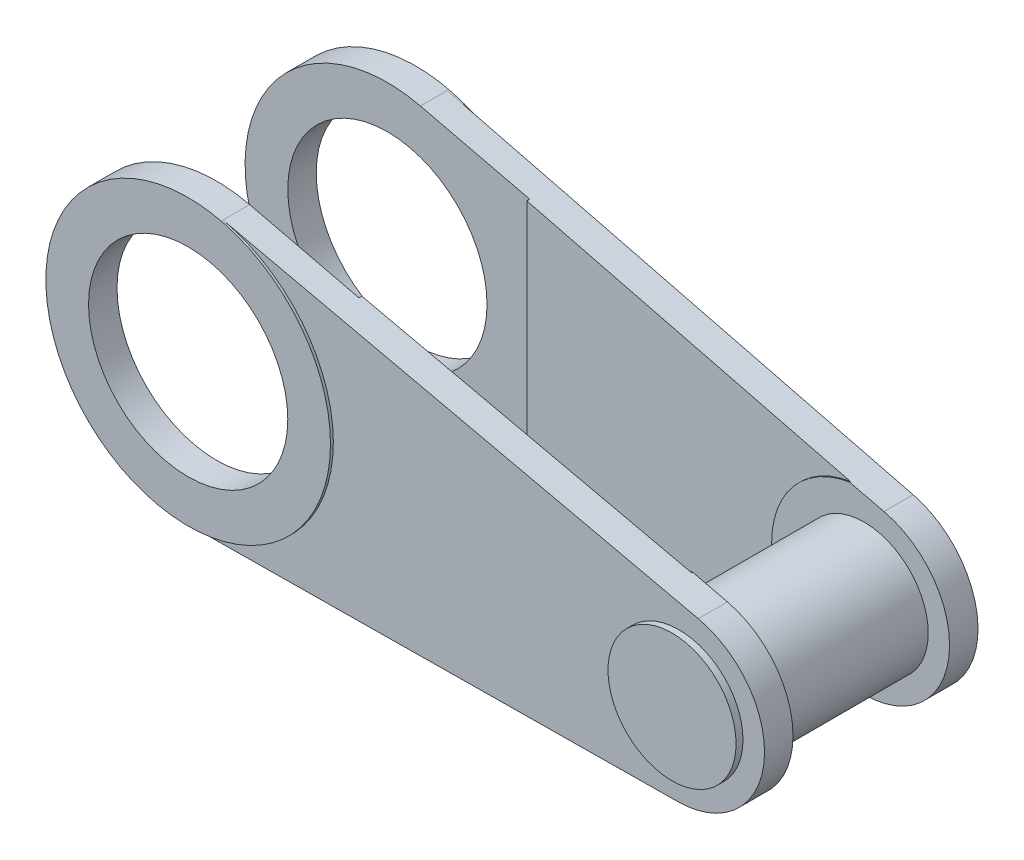
ISO-10303-21;
HEADER;
FILE_DESCRIPTION(('STEP AP214'),'2;1');
FILE_NAME('part.step','',(''),(''),'','','');
FILE_SCHEMA(('AUTOMOTIVE_DESIGN { 1 0 10303 214 1 1 1 1 }'));
ENDSEC;
DATA;
#1=APPLICATION_CONTEXT('core data for automotive mechanical design processes');
#2=APPLICATION_PROTOCOL_DEFINITION('international standard','automotive_design',2000,#1);
#3=PRODUCT_CONTEXT('',#1,'mechanical');
#4=PRODUCT('Part','Part','',(#3));
#5=PRODUCT_RELATED_PRODUCT_CATEGORY('part','',(#4));
#6=PRODUCT_DEFINITION_FORMATION('','',#4);
#7=PRODUCT_DEFINITION_CONTEXT('part definition',#1,'design');
#8=PRODUCT_DEFINITION('design','',#6,#7);
#9=PRODUCT_DEFINITION_SHAPE('','',#8);
#10=(LENGTH_UNIT() NAMED_UNIT(*) SI_UNIT(.MILLI.,.METRE.));
#11=(NAMED_UNIT(*) PLANE_ANGLE_UNIT() SI_UNIT($,.RADIAN.));
#12=(NAMED_UNIT(*) SI_UNIT($,.STERADIAN.) SOLID_ANGLE_UNIT());
#13=UNCERTAINTY_MEASURE_WITH_UNIT(LENGTH_MEASURE(1.E-05),#10,'distance_accuracy_value','');
#14=(GEOMETRIC_REPRESENTATION_CONTEXT(3) GLOBAL_UNCERTAINTY_ASSIGNED_CONTEXT((#13)) GLOBAL_UNIT_ASSIGNED_CONTEXT((#10,
#11,#12)) REPRESENTATION_CONTEXT('',''));
#15=CARTESIAN_POINT('',(0.,0.,0.));
#16=DIRECTION('',(0.,0.,1.));
#17=DIRECTION('',(1.,0.,0.));
#18=AXIS2_PLACEMENT_3D('',#15,#16,#17);
#19=CARTESIAN_POINT('',(0.,0.,0.));
#20=DIRECTION('',(0.,1.,0.));
#21=DIRECTION('',(0.,0.,1.));
#22=AXIS2_PLACEMENT_3D('',#19,#20,#21);
#23=PLANE('',#22);
#24=DIRECTION('',(0.,0.,-1.));
#25=VECTOR('',#24,1.);
#26=CARTESIAN_POINT('',(20.,0.,-6.));
#27=LINE('',#26,#25);
#28=CARTESIAN_POINT('',(20.,0.,-5.79990000249988));
#29=VERTEX_POINT('',#28);
#30=CARTESIAN_POINT('',(20.,0.,-6.));
#31=VERTEX_POINT('',#30);
#32=EDGE_CURVE('E284',#29,#31,#27,.T.);
#33=ORIENTED_EDGE('',*,*,#32,.T.);
#34=DIRECTION('',(-1.,0.,0.));
#35=VECTOR('',#34,1.);
#36=CARTESIAN_POINT('',(0.,0.,-6.));
#37=LINE('',#36,#35);
#38=CARTESIAN_POINT('',(10.,0.,-6.));
#39=VERTEX_POINT('',#38);
#40=EDGE_CURVE('E283',#31,#39,#37,.T.);
#41=ORIENTED_EDGE('',*,*,#40,.T.);
#42=DIRECTION('',(0.,0.,1.));
#43=VECTOR('',#42,1.);
#44=CARTESIAN_POINT('',(10.,0.,-25.));
#45=LINE('',#44,#43);
#46=CARTESIAN_POINT('',(10.,0.,-7.9));
#47=VERTEX_POINT('',#46);
#48=EDGE_CURVE('E409',#39,#47,#45,.F.);
#49=ORIENTED_EDGE('',*,*,#48,.T.);
#50=DIRECTION('',(-0.999950003749688,0.,-0.00999950003749657));
#51=VECTOR('',#50,1.);
#52=CARTESIAN_POINT('',(50.,0.,-7.50000000000002));
#53=LINE('',#52,#51);
#54=CARTESIAN_POINT('',(44.,0.,-7.56000000000001));
#55=VERTEX_POINT('',#54);
#56=EDGE_CURVE('E402',#55,#47,#53,.T.);
#57=ORIENTED_EDGE('',*,*,#56,.F.);
#58=DIRECTION('',(0.,0.,1.));
#59=VECTOR('',#58,1.);
#60=CARTESIAN_POINT('',(44.,0.,-25.));
#61=LINE('',#60,#59);
#62=CARTESIAN_POINT('',(44.,0.,-5.5));
#63=VERTEX_POINT('',#62);
#64=EDGE_CURVE('E406',#55,#63,#61,.T.);
#65=ORIENTED_EDGE('',*,*,#64,.T.);
#66=DIRECTION('',(-1.,0.,0.));
#67=VECTOR('',#66,1.);
#68=CARTESIAN_POINT('',(37.5,0.,-5.5));
#69=LINE('',#68,#67);
#70=CARTESIAN_POINT('',(41.5,0.,-5.5));
#71=VERTEX_POINT('',#70);
#72=EDGE_CURVE('E327',#63,#71,#69,.T.);
#73=ORIENTED_EDGE('',*,*,#72,.T.);
#74=DIRECTION('',(0.,0.,1.));
#75=VECTOR('',#74,1.);
#76=CARTESIAN_POINT('',(41.5,0.,-25.));
#77=LINE('',#76,#75);
#78=CARTESIAN_POINT('',(41.5,0.,-5.58490000249989));
#79=VERTEX_POINT('',#78);
#80=EDGE_CURVE('E380',#79,#71,#77,.T.);
#81=ORIENTED_EDGE('',*,*,#80,.F.);
#82=DIRECTION('',(-0.999950003749688,0.,-0.00999950003749657));
#83=VECTOR('',#82,1.);
#84=CARTESIAN_POINT('',(49.980000999925,0.,-5.50009999250064));
#85=LINE('',#84,#83);
#86=EDGE_CURVE('E368',#79,#29,#85,.T.);
#87=ORIENTED_EDGE('',*,*,#86,.T.);
#88=EDGE_LOOP('',(#33,#41,#49,#57,#65,#73,#81,#87));
#89=FACE_BOUND('',#88,.T.);
#90=ADVANCED_FACE('F155',(#89),#23,.F.);
#91=DIRECTION('',(1.,0.,0.));
#92=VECTOR('',#91,1.);
#93=CARTESIAN_POINT('',(0.,0.,6.));
#94=LINE('',#93,#92);
#95=CARTESIAN_POINT('',(10.,0.,6.));
#96=VERTEX_POINT('',#95);
#97=CARTESIAN_POINT('',(20.,0.,6.));
#98=VERTEX_POINT('',#97);
#99=EDGE_CURVE('E271',#96,#98,#94,.T.);
#100=ORIENTED_EDGE('',*,*,#99,.T.);
#101=CARTESIAN_POINT('',(20.,0.,5.79990000249987));
#102=VERTEX_POINT('',#101);
#103=EDGE_CURVE('E279',#98,#102,#27,.T.);
#104=ORIENTED_EDGE('',*,*,#103,.T.);
#105=DIRECTION('',(0.999950003749688,0.,-0.0099995000374972));
#106=VECTOR('',#105,1.);
#107=CARTESIAN_POINT('',(-0.0199990000749923,0.,6.00009999250063));
#108=LINE('',#107,#106);
#109=CARTESIAN_POINT('',(41.5,0.,5.58490000249986));
#110=VERTEX_POINT('',#109);
#111=EDGE_CURVE('E364',#102,#110,#108,.T.);
#112=ORIENTED_EDGE('',*,*,#111,.T.);
#113=CARTESIAN_POINT('',(41.5,0.,5.5));
#114=VERTEX_POINT('',#113);
#115=EDGE_CURVE('E379',#114,#110,#77,.T.);
#116=ORIENTED_EDGE('',*,*,#115,.F.);
#117=DIRECTION('',(1.,0.,0.));
#118=VECTOR('',#117,1.);
#119=CARTESIAN_POINT('',(37.5,0.,5.5));
#120=LINE('',#119,#118);
#121=CARTESIAN_POINT('',(44.,0.,5.5));
#122=VERTEX_POINT('',#121);
#123=EDGE_CURVE('E330',#114,#122,#120,.T.);
#124=ORIENTED_EDGE('',*,*,#123,.T.);
#125=CARTESIAN_POINT('',(44.,0.,7.55999999999999));
#126=VERTEX_POINT('',#125);
#127=EDGE_CURVE('E405',#122,#126,#61,.T.);
#128=ORIENTED_EDGE('',*,*,#127,.T.);
#129=DIRECTION('',(0.999950003749687,0.,-0.0099995000374972));
#130=VECTOR('',#129,1.);
#131=CARTESIAN_POINT('',(0.,0.,8.));
#132=LINE('',#131,#130);
#133=CARTESIAN_POINT('',(10.,0.,7.9));
#134=VERTEX_POINT('',#133);
#135=EDGE_CURVE('E399',#134,#126,#132,.T.);
#136=ORIENTED_EDGE('',*,*,#135,.F.);
#137=EDGE_CURVE('E289',#134,#96,#45,.F.);
#138=ORIENTED_EDGE('',*,*,#137,.T.);
#139=EDGE_LOOP('',(#100,#104,#112,#116,#124,#128,#136,#138));
#140=FACE_BOUND('',#139,.T.);
#141=ADVANCED_FACE('F286',(#140),#23,.F.);
#142=CARTESIAN_POINT('',(5.11689128586239,21.4457943598644,-25.));
#143=DIRECTION('',(-0.232081911262799,-0.972696245733788,0.));
#144=DIRECTION('',(0.972696245733788,-0.232081911262799,0.));
#145=AXIS2_PLACEMENT_3D('',#142,#143,#144);
#146=PLANE('',#145);
#147=DIRECTION('',(0.,0.,-1.));
#148=VECTOR('',#147,1.);
#149=CARTESIAN_POINT('',(20.,17.8947368421053,-25.));
#150=LINE('',#149,#148);
#151=CARTESIAN_POINT('',(20.,17.8947368421053,-5.79990000249988));
#152=VERTEX_POINT('',#151);
#153=CARTESIAN_POINT('',(20.,17.8947368421053,-6.));
#154=VERTEX_POINT('',#153);
#155=EDGE_CURVE('E307',#152,#154,#150,.T.);
#156=ORIENTED_EDGE('',*,*,#155,.F.);
#157=DIRECTION('',(0.97265023375542,-0.232070932966205,0.0097265023375539));
#158=VECTOR('',#157,1.);
#159=CARTESIAN_POINT('',(38.8612085593368,13.3945186595266,-5.61128791690652));
#160=LINE('',#159,#158);
#161=CARTESIAN_POINT('',(42.9607508532423,12.4163822525597,-5.57029249396747));
#162=VERTEX_POINT('',#161);
#163=EDGE_CURVE('E371',#152,#162,#160,.T.);
#164=ORIENTED_EDGE('',*,*,#163,.T.);
#165=DIRECTION('',(0.,0.,1.));
#166=VECTOR('',#165,1.);
#167=CARTESIAN_POINT('',(42.9607508532423,12.4163822525597,-25.));
#168=LINE('',#167,#166);
#169=CARTESIAN_POINT('',(42.9607508532423,12.4163822525597,-5.5));
#170=VERTEX_POINT('',#169);
#171=EDGE_CURVE('E376',#162,#170,#168,.T.);
#172=ORIENTED_EDGE('',*,*,#171,.T.);
#173=DIRECTION('',(-0.972696245733788,0.232081911262799,0.));
#174=VECTOR('',#173,1.);
#175=CARTESIAN_POINT('',(5.11689128586239,21.4457943598644,-5.5));
#176=LINE('',#175,#174);
#177=CARTESIAN_POINT('',(45.3924914675768,11.8361774744027,-5.5));
#178=VERTEX_POINT('',#177);
#179=EDGE_CURVE('E177',#178,#170,#176,.T.);
#180=ORIENTED_EDGE('',*,*,#179,.F.);
#181=DIRECTION('',(0.,0.,1.));
#182=VECTOR('',#181,1.);
#183=CARTESIAN_POINT('',(45.3924914675768,11.8361774744027,-25.));
#184=LINE('',#183,#182);
#185=CARTESIAN_POINT('',(45.3924914675768,11.8361774744027,-7.54607508532425));
#186=VERTEX_POINT('',#185);
#187=EDGE_CURVE('E384',#186,#178,#184,.T.);
#188=ORIENTED_EDGE('',*,*,#187,.F.);
#189=DIRECTION('',(0.97265023375542,-0.232070932966205,0.0097265023375539));
#190=VECTOR('',#189,1.);
#191=CARTESIAN_POINT('',(38.8801304749061,13.3900039568645,-7.61119869525095));
#192=LINE('',#191,#190);
#193=CARTESIAN_POINT('',(12.320819112628,19.7269624573379,-7.87679180887373));
#194=VERTEX_POINT('',#193);
#195=EDGE_CURVE('E411',#194,#186,#192,.T.);
#196=ORIENTED_EDGE('',*,*,#195,.F.);
#197=DIRECTION('',(0.,0.,1.));
#198=VECTOR('',#197,1.);
#199=CARTESIAN_POINT('',(12.320819112628,19.7269624573379,-25.));
#200=LINE('',#199,#198);
#201=CARTESIAN_POINT('',(12.320819112628,19.7269624573379,-6.));
#202=VERTEX_POINT('',#201);
#203=EDGE_CURVE('E389',#194,#202,#200,.T.);
#204=ORIENTED_EDGE('',*,*,#203,.T.);
#205=DIRECTION('',(-0.972696245733788,0.232081911262799,0.));
#206=VECTOR('',#205,1.);
#207=CARTESIAN_POINT('',(5.11689128586239,21.4457943598644,-6.));
#208=LINE('',#207,#206);
#209=EDGE_CURVE('E298',#154,#202,#208,.T.);
#210=ORIENTED_EDGE('',*,*,#209,.F.);
#211=EDGE_LOOP('',(#156,#164,#172,#180,#188,#196,#204,#210));
#212=FACE_BOUND('',#211,.T.);
#213=ADVANCED_FACE('F445',(#212),#146,.F.);
#214=DIRECTION('',(0.972696245733788,-0.232081911262799,0.));
#215=VECTOR('',#214,1.);
#216=CARTESIAN_POINT('',(5.11689128586239,21.4457943598644,6.));
#217=LINE('',#216,#215);
#218=CARTESIAN_POINT('',(12.320819112628,19.7269624573379,6.));
#219=VERTEX_POINT('',#218);
#220=CARTESIAN_POINT('',(20.,17.8947368421053,6.));
#221=VERTEX_POINT('',#220);
#222=EDGE_CURVE('E274',#219,#221,#217,.T.);
#223=ORIENTED_EDGE('',*,*,#222,.F.);
#224=CARTESIAN_POINT('',(12.320819112628,19.7269624573379,7.87679180887372));
#225=VERTEX_POINT('',#224);
#226=EDGE_CURVE('E383',#219,#225,#200,.T.);
#227=ORIENTED_EDGE('',*,*,#226,.T.);
#228=DIRECTION('',(-0.97265023375542,0.232070932966205,0.00972650233755451));
#229=VECTOR('',#228,1.);
#230=CARTESIAN_POINT('',(-8.42702362870361,24.6773249359714,8.08427023628704));
#231=LINE('',#230,#229);
#232=CARTESIAN_POINT('',(45.3924914675768,11.8361774744027,7.54607508532421));
#233=VERTEX_POINT('',#232);
#234=EDGE_CURVE('E387',#233,#225,#231,.T.);
#235=ORIENTED_EDGE('',*,*,#234,.F.);
#236=CARTESIAN_POINT('',(45.3924914675768,11.8361774744027,5.5));
#237=VERTEX_POINT('',#236);
#238=EDGE_CURVE('E388',#237,#233,#184,.T.);
#239=ORIENTED_EDGE('',*,*,#238,.F.);
#240=DIRECTION('',(0.972696245733788,-0.232081911262799,0.));
#241=VECTOR('',#240,1.);
#242=CARTESIAN_POINT('',(5.11689128586239,21.4457943598644,5.5));
#243=LINE('',#242,#241);
#244=CARTESIAN_POINT('',(42.9607508532423,12.4163822525597,5.5));
#245=VERTEX_POINT('',#244);
#246=EDGE_CURVE('E333',#245,#237,#243,.T.);
#247=ORIENTED_EDGE('',*,*,#246,.F.);
#248=CARTESIAN_POINT('',(42.9607508532424,12.4163822525597,5.57029249396744));
#249=VERTEX_POINT('',#248);
#250=EDGE_CURVE('E373',#245,#249,#168,.T.);
#251=ORIENTED_EDGE('',*,*,#250,.T.);
#252=DIRECTION('',(-0.97265023375542,0.232070932966205,0.00972650233755451));
#253=VECTOR('',#252,1.);
#254=CARTESIAN_POINT('',(-8.44594554427292,24.6818396386335,6.08435945794261));
#255=LINE('',#254,#253);
#256=CARTESIAN_POINT('',(20.,17.8947368421053,5.79990000249987));
#257=VERTEX_POINT('',#256);
#258=EDGE_CURVE('E360',#249,#257,#255,.T.);
#259=ORIENTED_EDGE('',*,*,#258,.T.);
#260=DIRECTION('',(0.,0.,-1.));
#261=VECTOR('',#260,1.);
#262=CARTESIAN_POINT('',(20.,17.8947368421053,-25.));
#263=LINE('',#262,#261);
#264=EDGE_CURVE('E170',#221,#257,#263,.T.);
#265=ORIENTED_EDGE('',*,*,#264,.F.);
#266=EDGE_LOOP('',(#223,#227,#235,#239,#247,#251,#259,#265));
#267=FACE_BOUND('',#266,.T.);
#268=ADVANCED_FACE('F582',(#267),#146,.F.);
#269=CARTESIAN_POINT('',(49.980000999925,60.,-5.50009999250064));
#270=DIRECTION('',(-0.00999950003749657,0.,0.999950003749687));
#271=DIRECTION('',(0.999950003749688,0.,0.00999950003749657));
#272=AXIS2_PLACEMENT_3D('',#269,#270,#271);
#273=PLANE('',#272);
#274=ORIENTED_EDGE('',*,*,#163,.F.);
#275=DIRECTION('',(0.,-1.,0.));
#276=VECTOR('',#275,1.);
#277=CARTESIAN_POINT('',(20.,60.,-5.79990000249988));
#278=LINE('',#277,#276);
#279=EDGE_CURVE('E305',#152,#29,#278,.T.);
#280=ORIENTED_EDGE('',*,*,#279,.T.);
#281=ORIENTED_EDGE('',*,*,#86,.F.);
#282=CARTESIAN_POINT('',(44.,6.,-5.55990000249989));
#283=DIRECTION('',(-0.00999950003749657,0.,0.999950003749687));
#284=DIRECTION('',(0.999950003749688,0.,0.00999950003749657));
#285=AXIS2_PLACEMENT_3D('',#282,#283,#284);
#286=ELLIPSE('',#285,6.5003249918754,6.5);
#287=EDGE_CURVE('E365',#162,#79,#286,.T.);
#288=ORIENTED_EDGE('',*,*,#287,.F.);
#289=EDGE_LOOP('',(#274,#280,#281,#288));
#290=FACE_BOUND('',#289,.T.);
#291=ADVANCED_FACE('F485',(#290),#273,.T.);
#292=CARTESIAN_POINT('',(10.,10.,-25.));
#293=DIRECTION('',(0.,0.,1.));
#294=DIRECTION('',(1.,0.,0.));
#295=AXIS2_PLACEMENT_3D('',#292,#293,#294);
#296=CYLINDRICAL_SURFACE('',#295,10.);
#297=CARTESIAN_POINT('',(10.,10.,8.));
#298=DIRECTION('',(0.,0.,1.));
#299=DIRECTION('',(1.,0.,0.));
#300=AXIS2_PLACEMENT_3D('',#297,#298,#299);
#301=CIRCLE('',#300,10.);
#302=CARTESIAN_POINT('',(20.,10.,8.));
#303=VERTEX_POINT('',#302);
#304=EDGE_CURVE('E349',#303,#303,#301,.T.);
#305=ORIENTED_EDGE('',*,*,#304,.F.);
#306=EDGE_LOOP('',(#305));
#307=FACE_BOUND('',#306,.T.);
#308=CARTESIAN_POINT('',(10.,10.,6.));
#309=DIRECTION('',(0.,0.,-1.));
#310=DIRECTION('',(-1.,0.,0.));
#311=AXIS2_PLACEMENT_3D('',#308,#309,#310);
#312=CIRCLE('',#311,10.);
#313=EDGE_CURVE('E301',#96,#219,#312,.T.);
#314=ORIENTED_EDGE('',*,*,#313,.F.);
#315=ORIENTED_EDGE('',*,*,#137,.F.);
#316=CARTESIAN_POINT('',(10.,10.,7.9));
#317=DIRECTION('',(-0.0099995000374972,0.,-0.999950003749688));
#318=DIRECTION('',(0.999950003749688,0.,-0.0099995000374972));
#319=AXIS2_PLACEMENT_3D('',#316,#317,#318);
#320=ELLIPSE('',#319,10.0004999875006,10.);
#321=EDGE_CURVE('E357',#134,#225,#320,.F.);
#322=ORIENTED_EDGE('',*,*,#321,.T.);
#323=ORIENTED_EDGE('',*,*,#226,.F.);
#324=EDGE_LOOP('',(#314,#315,#322,#323));
#325=FACE_BOUND('',#324,.T.);
#326=ADVANCED_FACE('F597',(#307,#325),#296,.T.);
#327=CARTESIAN_POINT('',(10.,10.,-8.));
#328=DIRECTION('',(0.,0.,1.));
#329=DIRECTION('',(1.,0.,0.));
#330=AXIS2_PLACEMENT_3D('',#327,#328,#329);
#331=CIRCLE('',#330,10.);
#332=CARTESIAN_POINT('',(20.,10.,-8.));
#333=VERTEX_POINT('',#332);
#334=EDGE_CURVE('E346',#333,#333,#331,.T.);
#335=ORIENTED_EDGE('',*,*,#334,.T.);
#336=EDGE_LOOP('',(#335));
#337=FACE_BOUND('',#336,.T.);
#338=CARTESIAN_POINT('',(10.,10.,-6.));
#339=DIRECTION('',(0.,0.,1.));
#340=DIRECTION('',(1.,0.,0.));
#341=AXIS2_PLACEMENT_3D('',#338,#339,#340);
#342=CIRCLE('',#341,10.);
#343=EDGE_CURVE('E296',#202,#39,#342,.T.);
#344=ORIENTED_EDGE('',*,*,#343,.F.);
#345=ORIENTED_EDGE('',*,*,#203,.F.);
#346=CARTESIAN_POINT('',(10.,10.,-7.9));
#347=DIRECTION('',(-0.00999950003749657,0.,0.999950003749687));
#348=DIRECTION('',(-0.999950003749688,0.,-0.00999950003749657));
#349=AXIS2_PLACEMENT_3D('',#346,#347,#348);
#350=ELLIPSE('',#349,10.0004999875006,10.);
#351=EDGE_CURVE('E352',#194,#47,#350,.F.);
#352=ORIENTED_EDGE('',*,*,#351,.T.);
#353=ORIENTED_EDGE('',*,*,#48,.F.);
#354=EDGE_LOOP('',(#344,#345,#352,#353));
#355=FACE_BOUND('',#354,.T.);
#356=ADVANCED_FACE('F434',(#337,#355),#296,.T.);
#357=CARTESIAN_POINT('',(-0.0199990000749923,60.,6.00009999250063));
#358=DIRECTION('',(-0.0099995000374972,0.,-0.999950003749688));
#359=DIRECTION('',(-0.999950003749688,0.,0.0099995000374972));
#360=AXIS2_PLACEMENT_3D('',#357,#358,#359);
#361=PLANE('',#360);
#362=ORIENTED_EDGE('',*,*,#111,.F.);
#363=DIRECTION('',(0.,1.,0.));
#364=VECTOR('',#363,1.);
#365=CARTESIAN_POINT('',(20.,60.,5.79990000249987));
#366=LINE('',#365,#364);
#367=EDGE_CURVE('E12',#102,#257,#366,.T.);
#368=ORIENTED_EDGE('',*,*,#367,.T.);
#369=ORIENTED_EDGE('',*,*,#258,.F.);
#370=CARTESIAN_POINT('',(44.,6.,5.55990000249986));
#371=DIRECTION('',(-0.0099995000374972,0.,-0.999950003749688));
#372=DIRECTION('',(-0.999950003749688,0.,0.0099995000374972));
#373=AXIS2_PLACEMENT_3D('',#370,#371,#372);
#374=ELLIPSE('',#373,6.5003249918754,6.5);
#375=EDGE_CURVE('E361',#110,#249,#374,.T.);
#376=ORIENTED_EDGE('',*,*,#375,.F.);
#377=EDGE_LOOP('',(#362,#368,#369,#376));
#378=FACE_BOUND('',#377,.T.);
#379=ADVANCED_FACE('F425',(#378),#361,.T.);
#380=CARTESIAN_POINT('',(10.,10.,-25.));
#381=DIRECTION('',(0.,0.,1.));
#382=DIRECTION('',(1.,0.,0.));
#383=AXIS2_PLACEMENT_3D('',#380,#381,#382);
#384=CYLINDRICAL_SURFACE('',#383,7.);
#385=CARTESIAN_POINT('',(10.,10.,8.));
#386=DIRECTION('',(0.,0.,1.));
#387=DIRECTION('',(1.,0.,0.));
#388=AXIS2_PLACEMENT_3D('',#385,#386,#387);
#389=CIRCLE('',#388,7.);
#390=CARTESIAN_POINT('',(17.,10.,8.));
#391=VERTEX_POINT('',#390);
#392=EDGE_CURVE('E343',#391,#391,#389,.T.);
#393=ORIENTED_EDGE('',*,*,#392,.T.);
#394=EDGE_LOOP('',(#393));
#395=FACE_BOUND('',#394,.T.);
#396=CARTESIAN_POINT('',(10.,10.,6.));
#397=DIRECTION('',(0.,0.,-1.));
#398=DIRECTION('',(-1.,0.,0.));
#399=AXIS2_PLACEMENT_3D('',#396,#397,#398);
#400=CIRCLE('',#399,7.);
#401=CARTESIAN_POINT('',(3.,10.,6.));
#402=VERTEX_POINT('',#401);
#403=EDGE_CURVE('E300',#402,#402,#400,.F.);
#404=ORIENTED_EDGE('',*,*,#403,.F.);
#405=EDGE_LOOP('',(#404));
#406=FACE_BOUND('',#405,.T.);
#407=ADVANCED_FACE('F422',(#395,#406),#384,.F.);
#408=CARTESIAN_POINT('',(10.,10.,-8.));
#409=DIRECTION('',(0.,0.,1.));
#410=DIRECTION('',(1.,0.,0.));
#411=AXIS2_PLACEMENT_3D('',#408,#409,#410);
#412=CIRCLE('',#411,7.);
#413=CARTESIAN_POINT('',(17.,10.,-8.));
#414=VERTEX_POINT('',#413);
#415=EDGE_CURVE('E342',#414,#414,#412,.T.);
#416=ORIENTED_EDGE('',*,*,#415,.F.);
#417=EDGE_LOOP('',(#416));
#418=FACE_BOUND('',#417,.T.);
#419=CARTESIAN_POINT('',(10.,10.,-6.));
#420=DIRECTION('',(0.,0.,1.));
#421=DIRECTION('',(1.,0.,0.));
#422=AXIS2_PLACEMENT_3D('',#419,#420,#421);
#423=CIRCLE('',#422,7.);
#424=CARTESIAN_POINT('',(17.,10.,-6.));
#425=VERTEX_POINT('',#424);
#426=EDGE_CURVE('E275',#425,#425,#423,.F.);
#427=ORIENTED_EDGE('',*,*,#426,.F.);
#428=EDGE_LOOP('',(#427));
#429=FACE_BOUND('',#428,.T.);
#430=ADVANCED_FACE('F424',(#418,#429),#384,.F.);
#431=CARTESIAN_POINT('',(44.,6.,-25.));
#432=DIRECTION('',(0.,0.,1.));
#433=DIRECTION('',(1.,0.,0.));
#434=AXIS2_PLACEMENT_3D('',#431,#432,#433);
#435=CYLINDRICAL_SURFACE('',#434,6.);
#436=ORIENTED_EDGE('',*,*,#187,.T.);
#437=CARTESIAN_POINT('',(44.,6.,-5.5));
#438=DIRECTION('',(0.,0.,1.));
#439=DIRECTION('',(1.,0.,0.));
#440=AXIS2_PLACEMENT_3D('',#437,#438,#439);
#441=CIRCLE('',#440,6.);
#442=EDGE_CURVE('E339',#178,#63,#441,.F.);
#443=ORIENTED_EDGE('',*,*,#442,.T.);
#444=ORIENTED_EDGE('',*,*,#64,.F.);
#445=CARTESIAN_POINT('',(44.,6.,-7.56000000000001));
#446=DIRECTION('',(-0.00999950003749657,0.,0.999950003749687));
#447=DIRECTION('',(0.999950003749688,0.,0.00999950003749657));
#448=AXIS2_PLACEMENT_3D('',#445,#446,#447);
#449=ELLIPSE('',#448,6.00029999250037,6.);
#450=EDGE_CURVE('E394',#55,#186,#449,.T.);
#451=ORIENTED_EDGE('',*,*,#450,.T.);
#452=EDGE_LOOP('',(#436,#443,#444,#451));
#453=FACE_BOUND('',#452,.T.);
#454=ADVANCED_FACE('F432',(#453),#435,.T.);
#455=ORIENTED_EDGE('',*,*,#127,.F.);
#456=CARTESIAN_POINT('',(44.,6.,5.5));
#457=DIRECTION('',(0.,0.,-1.));
#458=DIRECTION('',(-1.,0.,0.));
#459=AXIS2_PLACEMENT_3D('',#456,#457,#458);
#460=CIRCLE('',#459,6.);
#461=EDGE_CURVE('E335',#122,#237,#460,.F.);
#462=ORIENTED_EDGE('',*,*,#461,.T.);
#463=ORIENTED_EDGE('',*,*,#238,.T.);
#464=CARTESIAN_POINT('',(44.,6.,7.55999999999998));
#465=DIRECTION('',(-0.0099995000374972,0.,-0.999950003749688));
#466=DIRECTION('',(-0.999950003749688,0.,0.0099995000374972));
#467=AXIS2_PLACEMENT_3D('',#464,#465,#466);
#468=ELLIPSE('',#467,6.00029999250037,6.);
#469=EDGE_CURVE('E396',#233,#126,#468,.T.);
#470=ORIENTED_EDGE('',*,*,#469,.T.);
#471=EDGE_LOOP('',(#455,#462,#463,#470));
#472=FACE_BOUND('',#471,.T.);
#473=ADVANCED_FACE('F642',(#472),#435,.T.);
#474=CARTESIAN_POINT('',(44.,6.,-25.));
#475=DIRECTION('',(0.,0.,1.));
#476=DIRECTION('',(1.,0.,0.));
#477=AXIS2_PLACEMENT_3D('',#474,#475,#476);
#478=CYLINDRICAL_SURFACE('',#477,6.5);
#479=ORIENTED_EDGE('',*,*,#80,.T.);
#480=CARTESIAN_POINT('',(44.,6.,-5.5));
#481=DIRECTION('',(0.,0.,1.));
#482=DIRECTION('',(1.,0.,0.));
#483=AXIS2_PLACEMENT_3D('',#480,#481,#482);
#484=CIRCLE('',#483,6.5);
#485=EDGE_CURVE('E163',#71,#170,#484,.F.);
#486=ORIENTED_EDGE('',*,*,#485,.T.);
#487=ORIENTED_EDGE('',*,*,#171,.F.);
#488=ORIENTED_EDGE('',*,*,#287,.T.);
#489=EDGE_LOOP('',(#479,#486,#487,#488));
#490=FACE_BOUND('',#489,.T.);
#491=ADVANCED_FACE('F487',(#490),#478,.T.);
#492=CARTESIAN_POINT('',(44.,6.,5.5));
#493=DIRECTION('',(0.,0.,-1.));
#494=DIRECTION('',(-1.,0.,0.));
#495=AXIS2_PLACEMENT_3D('',#492,#493,#494);
#496=CIRCLE('',#495,6.5);
#497=EDGE_CURVE('E414',#245,#114,#496,.F.);
#498=ORIENTED_EDGE('',*,*,#497,.T.);
#499=ORIENTED_EDGE('',*,*,#115,.T.);
#500=ORIENTED_EDGE('',*,*,#375,.T.);
#501=ORIENTED_EDGE('',*,*,#250,.F.);
#502=EDGE_LOOP('',(#498,#499,#500,#501));
#503=FACE_BOUND('',#502,.T.);
#504=ADVANCED_FACE('F457',(#503),#478,.T.);
#505=CARTESIAN_POINT('',(0.,60.,8.));
#506=DIRECTION('',(-0.0099995000374972,0.,-0.999950003749688));
#507=DIRECTION('',(-0.999950003749688,0.,0.0099995000374972));
#508=AXIS2_PLACEMENT_3D('',#505,#506,#507);
#509=PLANE('',#508);
#510=CARTESIAN_POINT('',(44.,6.,7.55999999999999));
#511=DIRECTION('',(-0.0099995000374972,0.,-0.999950003749688));
#512=DIRECTION('',(0.999950003749688,0.,-0.0099995000374972));
#513=AXIS2_PLACEMENT_3D('',#510,#511,#512);
#514=ELLIPSE('',#513,4.50022499437528,4.5);
#515=CARTESIAN_POINT('',(48.5,6.,7.51499999999998));
#516=VERTEX_POINT('',#515);
#517=EDGE_CURVE('E324',#516,#516,#514,.F.);
#518=ORIENTED_EDGE('',*,*,#517,.F.);
#519=EDGE_LOOP('',(#518));
#520=FACE_BOUND('',#519,.T.);
#521=ORIENTED_EDGE('',*,*,#321,.F.);
#522=ORIENTED_EDGE('',*,*,#135,.T.);
#523=ORIENTED_EDGE('',*,*,#469,.F.);
#524=ORIENTED_EDGE('',*,*,#234,.T.);
#525=EDGE_LOOP('',(#521,#522,#523,#524));
#526=FACE_BOUND('',#525,.T.);
#527=ADVANCED_FACE('F157',(#520,#526),#509,.F.);
#528=CARTESIAN_POINT('',(50.,60.,-7.50000000000002));
#529=DIRECTION('',(-0.00999950003749657,0.,0.999950003749687));
#530=DIRECTION('',(0.999950003749688,0.,0.00999950003749657));
#531=AXIS2_PLACEMENT_3D('',#528,#529,#530);
#532=PLANE('',#531);
#533=CARTESIAN_POINT('',(44.,6.,-7.56000000000001));
#534=DIRECTION('',(-0.00999950003749657,0.,0.999950003749687));
#535=DIRECTION('',(-0.999950003749688,0.,-0.00999950003749657));
#536=AXIS2_PLACEMENT_3D('',#533,#534,#535);
#537=ELLIPSE('',#536,4.50022499437528,4.5);
#538=CARTESIAN_POINT('',(39.5,6.,-7.60500000000001));
#539=VERTEX_POINT('',#538);
#540=EDGE_CURVE('E321',#539,#539,#537,.F.);
#541=ORIENTED_EDGE('',*,*,#540,.F.);
#542=EDGE_LOOP('',(#541));
#543=FACE_BOUND('',#542,.T.);
#544=ORIENTED_EDGE('',*,*,#351,.F.);
#545=ORIENTED_EDGE('',*,*,#195,.T.);
#546=ORIENTED_EDGE('',*,*,#450,.F.);
#547=ORIENTED_EDGE('',*,*,#56,.T.);
#548=EDGE_LOOP('',(#544,#545,#546,#547));
#549=FACE_BOUND('',#548,.T.);
#550=ADVANCED_FACE('F446',(#543,#549),#532,.F.);
#551=CARTESIAN_POINT('',(10.,10.,-8.));
#552=DIRECTION('',(0.,0.,1.));
#553=DIRECTION('',(1.,0.,0.));
#554=AXIS2_PLACEMENT_3D('',#551,#552,#553);
#555=PLANE('',#554);
#556=ORIENTED_EDGE('',*,*,#334,.F.);
#557=EDGE_LOOP('',(#556));
#558=FACE_BOUND('',#557,.T.);
#559=ORIENTED_EDGE('',*,*,#415,.T.);
#560=EDGE_LOOP('',(#559));
#561=FACE_BOUND('',#560,.T.);
#562=ADVANCED_FACE('F448',(#558,#561),#555,.F.);
#563=CARTESIAN_POINT('',(10.,10.,8.));
#564=DIRECTION('',(0.,0.,1.));
#565=DIRECTION('',(1.,0.,0.));
#566=AXIS2_PLACEMENT_3D('',#563,#564,#565);
#567=PLANE('',#566);
#568=ORIENTED_EDGE('',*,*,#304,.T.);
#569=EDGE_LOOP('',(#568));
#570=FACE_BOUND('',#569,.T.);
#571=ORIENTED_EDGE('',*,*,#392,.F.);
#572=EDGE_LOOP('',(#571));
#573=FACE_BOUND('',#572,.T.);
#574=ADVANCED_FACE('F454',(#570,#573),#567,.T.);
#575=CARTESIAN_POINT('',(37.5,20.,5.5));
#576=DIRECTION('',(0.,0.,-1.));
#577=DIRECTION('',(-1.,0.,0.));
#578=AXIS2_PLACEMENT_3D('',#575,#576,#577);
#579=PLANE('',#578);
#580=ORIENTED_EDGE('',*,*,#123,.F.);
#581=ORIENTED_EDGE('',*,*,#497,.F.);
#582=ORIENTED_EDGE('',*,*,#246,.T.);
#583=ORIENTED_EDGE('',*,*,#461,.F.);
#584=EDGE_LOOP('',(#580,#581,#582,#583));
#585=FACE_BOUND('',#584,.T.);
#586=CARTESIAN_POINT('',(44.,6.,5.5));
#587=DIRECTION('',(0.,0.,-1.));
#588=DIRECTION('',(-1.,0.,0.));
#589=AXIS2_PLACEMENT_3D('',#586,#587,#588);
#590=CIRCLE('',#589,4.5);
#591=CARTESIAN_POINT('',(39.5,6.,5.5));
#592=VERTEX_POINT('',#591);
#593=EDGE_CURVE('E318',#592,#592,#590,.F.);
#594=ORIENTED_EDGE('',*,*,#593,.T.);
#595=EDGE_LOOP('',(#594));
#596=FACE_BOUND('',#595,.T.);
#597=ADVANCED_FACE('F493',(#585,#596),#579,.T.);
#598=CARTESIAN_POINT('',(37.5,20.,-5.5));
#599=DIRECTION('',(0.,0.,1.));
#600=DIRECTION('',(1.,0.,0.));
#601=AXIS2_PLACEMENT_3D('',#598,#599,#600);
#602=PLANE('',#601);
#603=ORIENTED_EDGE('',*,*,#179,.T.);
#604=ORIENTED_EDGE('',*,*,#485,.F.);
#605=ORIENTED_EDGE('',*,*,#72,.F.);
#606=ORIENTED_EDGE('',*,*,#442,.F.);
#607=EDGE_LOOP('',(#603,#604,#605,#606));
#608=FACE_BOUND('',#607,.T.);
#609=CARTESIAN_POINT('',(44.,6.,-5.5));
#610=DIRECTION('',(0.,0.,1.));
#611=DIRECTION('',(1.,0.,0.));
#612=AXIS2_PLACEMENT_3D('',#609,#610,#611);
#613=CIRCLE('',#612,4.5);
#614=CARTESIAN_POINT('',(48.5,6.,-5.5));
#615=VERTEX_POINT('',#614);
#616=EDGE_CURVE('E313',#615,#615,#613,.F.);
#617=ORIENTED_EDGE('',*,*,#616,.T.);
#618=EDGE_LOOP('',(#617));
#619=FACE_BOUND('',#618,.T.);
#620=ADVANCED_FACE('F489',(#608,#619),#602,.T.);
#621=CARTESIAN_POINT('',(44.,6.,8.));
#622=DIRECTION('',(0.,0.,-1.));
#623=DIRECTION('',(-1.,0.,0.));
#624=AXIS2_PLACEMENT_3D('',#621,#622,#623);
#625=CYLINDRICAL_SURFACE('',#624,4.5);
#626=ORIENTED_EDGE('',*,*,#593,.F.);
#627=EDGE_LOOP('',(#626));
#628=FACE_BOUND('',#627,.T.);
#629=ORIENTED_EDGE('',*,*,#616,.F.);
#630=EDGE_LOOP('',(#629));
#631=FACE_BOUND('',#630,.T.);
#632=ADVANCED_FACE('F492',(#628,#631),#625,.T.);
#633=CARTESIAN_POINT('',(44.,6.,-8.));
#634=DIRECTION('',(0.,0.,1.));
#635=DIRECTION('',(1.,0.,0.));
#636=AXIS2_PLACEMENT_3D('',#633,#634,#635);
#637=PLANE('',#636);
#638=CARTESIAN_POINT('',(44.,6.,-8.));
#639=DIRECTION('',(0.,0.,1.));
#640=DIRECTION('',(1.,0.,0.));
#641=AXIS2_PLACEMENT_3D('',#638,#639,#640);
#642=CIRCLE('',#641,4.5);
#643=CARTESIAN_POINT('',(48.5,6.,-8.));
#644=VERTEX_POINT('',#643);
#645=EDGE_CURVE('E309',#644,#644,#642,.T.);
#646=ORIENTED_EDGE('',*,*,#645,.F.);
#647=EDGE_LOOP('',(#646));
#648=FACE_BOUND('',#647,.T.);
#649=ADVANCED_FACE('F498',(#648),#637,.F.);
#650=ORIENTED_EDGE('',*,*,#645,.T.);
#651=EDGE_LOOP('',(#650));
#652=FACE_BOUND('',#651,.T.);
#653=ORIENTED_EDGE('',*,*,#540,.T.);
#654=EDGE_LOOP('',(#653));
#655=FACE_BOUND('',#654,.T.);
#656=ADVANCED_FACE('F502',(#652,#655),#625,.T.);
#657=CARTESIAN_POINT('',(44.,6.,8.));
#658=DIRECTION('',(0.,0.,1.));
#659=DIRECTION('',(1.,0.,0.));
#660=AXIS2_PLACEMENT_3D('',#657,#658,#659);
#661=CIRCLE('',#660,4.5);
#662=CARTESIAN_POINT('',(48.5,6.,8.));
#663=VERTEX_POINT('',#662);
#664=EDGE_CURVE('E310',#663,#663,#661,.T.);
#665=ORIENTED_EDGE('',*,*,#664,.F.);
#666=EDGE_LOOP('',(#665));
#667=FACE_BOUND('',#666,.T.);
#668=ORIENTED_EDGE('',*,*,#517,.T.);
#669=EDGE_LOOP('',(#668));
#670=FACE_BOUND('',#669,.T.);
#671=ADVANCED_FACE('F501',(#667,#670),#625,.T.);
#672=CARTESIAN_POINT('',(44.,6.,8.));
#673=DIRECTION('',(0.,0.,1.));
#674=DIRECTION('',(1.,0.,0.));
#675=AXIS2_PLACEMENT_3D('',#672,#673,#674);
#676=PLANE('',#675);
#677=ORIENTED_EDGE('',*,*,#664,.T.);
#678=EDGE_LOOP('',(#677));
#679=FACE_BOUND('',#678,.T.);
#680=ADVANCED_FACE('F511',(#679),#676,.T.);
#681=CARTESIAN_POINT('',(0.,20.,-6.));
#682=DIRECTION('',(0.,0.,1.));
#683=DIRECTION('',(1.,0.,0.));
#684=AXIS2_PLACEMENT_3D('',#681,#682,#683);
#685=PLANE('',#684);
#686=ORIENTED_EDGE('',*,*,#426,.T.);
#687=EDGE_LOOP('',(#686));
#688=FACE_BOUND('',#687,.T.);
#689=ORIENTED_EDGE('',*,*,#209,.T.);
#690=ORIENTED_EDGE('',*,*,#343,.T.);
#691=ORIENTED_EDGE('',*,*,#40,.F.);
#692=DIRECTION('',(0.,-1.,0.));
#693=VECTOR('',#692,1.);
#694=CARTESIAN_POINT('',(20.,20.,-6.));
#695=LINE('',#694,#693);
#696=EDGE_CURVE('E276',#154,#31,#695,.T.);
#697=ORIENTED_EDGE('',*,*,#696,.F.);
#698=EDGE_LOOP('',(#689,#690,#691,#697));
#699=FACE_BOUND('',#698,.T.);
#700=ADVANCED_FACE('F474',(#688,#699),#685,.T.);
#701=CARTESIAN_POINT('',(20.,20.,-6.));
#702=DIRECTION('',(-1.,0.,0.));
#703=DIRECTION('',(0.,0.,1.));
#704=AXIS2_PLACEMENT_3D('',#701,#702,#703);
#705=PLANE('',#704);
#706=ORIENTED_EDGE('',*,*,#155,.T.);
#707=ORIENTED_EDGE('',*,*,#696,.T.);
#708=ORIENTED_EDGE('',*,*,#32,.F.);
#709=ORIENTED_EDGE('',*,*,#279,.F.);
#710=EDGE_LOOP('',(#706,#707,#708,#709));
#711=FACE_BOUND('',#710,.T.);
#712=ADVANCED_FACE('F480',(#711),#705,.T.);
#713=ORIENTED_EDGE('',*,*,#264,.T.);
#714=ORIENTED_EDGE('',*,*,#367,.F.);
#715=ORIENTED_EDGE('',*,*,#103,.F.);
#716=DIRECTION('',(0.,-1.,0.));
#717=VECTOR('',#716,1.);
#718=CARTESIAN_POINT('',(20.,20.,6.));
#719=LINE('',#718,#717);
#720=EDGE_CURVE('E267',#221,#98,#719,.T.);
#721=ORIENTED_EDGE('',*,*,#720,.F.);
#722=EDGE_LOOP('',(#713,#714,#715,#721));
#723=FACE_BOUND('',#722,.T.);
#724=ADVANCED_FACE('F280',(#723),#705,.T.);
#725=CARTESIAN_POINT('',(0.,20.,6.));
#726=DIRECTION('',(0.,0.,-1.));
#727=DIRECTION('',(-1.,0.,0.));
#728=AXIS2_PLACEMENT_3D('',#725,#726,#727);
#729=PLANE('',#728);
#730=ORIENTED_EDGE('',*,*,#403,.T.);
#731=EDGE_LOOP('',(#730));
#732=FACE_BOUND('',#731,.T.);
#733=ORIENTED_EDGE('',*,*,#222,.T.);
#734=ORIENTED_EDGE('',*,*,#720,.T.);
#735=ORIENTED_EDGE('',*,*,#99,.F.);
#736=ORIENTED_EDGE('',*,*,#313,.T.);
#737=EDGE_LOOP('',(#733,#734,#735,#736));
#738=FACE_BOUND('',#737,.T.);
#739=ADVANCED_FACE('F269',(#732,#738),#729,.T.);
#740=CLOSED_SHELL('',(#90,#141,#213,#268,#291,#326,#356,#379,#407,#430,#454,#473,#491,#504,#527,
#550,#562,#574,#597,#620,#632,#649,#656,#671,#680,#700,#712,#724,#739));
#741=MANIFOLD_SOLID_BREP('B2',#740);
#742=ADVANCED_BREP_SHAPE_REPRESENTATION('',(#18,#741),#14);
#743=SHAPE_DEFINITION_REPRESENTATION(#9,#742);
ENDSEC;
END-ISO-10303-21;
